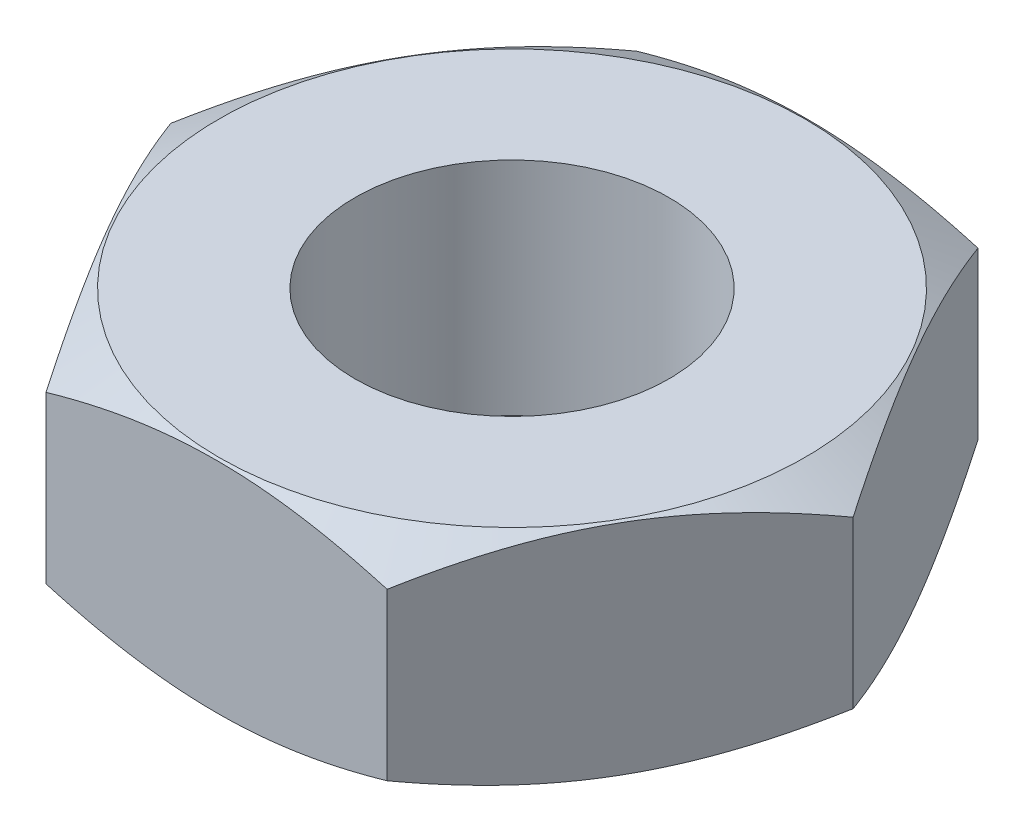
ISO-10303-21;
HEADER;
FILE_DESCRIPTION(('STEP AP214'),'2;1');
FILE_NAME('part.step','',(''),(''),'','','');
FILE_SCHEMA(('AUTOMOTIVE_DESIGN { 1 0 10303 214 1 1 1 1 }'));
ENDSEC;
DATA;
#1=APPLICATION_CONTEXT('core data for automotive mechanical design processes');
#2=APPLICATION_PROTOCOL_DEFINITION('international standard','automotive_design',2000,#1);
#3=PRODUCT_CONTEXT('',#1,'mechanical');
#4=PRODUCT('Part','Part','',(#3));
#5=PRODUCT_RELATED_PRODUCT_CATEGORY('part','',(#4));
#6=PRODUCT_DEFINITION_FORMATION('','',#4);
#7=PRODUCT_DEFINITION_CONTEXT('part definition',#1,'design');
#8=PRODUCT_DEFINITION('design','',#6,#7);
#9=PRODUCT_DEFINITION_SHAPE('','',#8);
#10=(LENGTH_UNIT() NAMED_UNIT(*) SI_UNIT(.MILLI.,.METRE.));
#11=(NAMED_UNIT(*) PLANE_ANGLE_UNIT() SI_UNIT($,.RADIAN.));
#12=(NAMED_UNIT(*) SI_UNIT($,.STERADIAN.) SOLID_ANGLE_UNIT());
#13=UNCERTAINTY_MEASURE_WITH_UNIT(LENGTH_MEASURE(1.E-05),#10,'distance_accuracy_value','');
#14=(GEOMETRIC_REPRESENTATION_CONTEXT(3) GLOBAL_UNCERTAINTY_ASSIGNED_CONTEXT((#13)) GLOBAL_UNIT_ASSIGNED_CONTEXT((#10,
#11,#12)) REPRESENTATION_CONTEXT('',''));
#15=CARTESIAN_POINT('',(0.,0.,0.));
#16=DIRECTION('',(0.,0.,1.));
#17=DIRECTION('',(1.,0.,0.));
#18=AXIS2_PLACEMENT_3D('',#15,#16,#17);
#19=CARTESIAN_POINT('',(-264.060006452342,-228.941222168841,-864.566900814825));
#20=DIRECTION('',(-0.866025403784429,0.,0.500000000000016));
#21=DIRECTION('',(0.500000000000016,0.,0.866025403784429));
#22=AXIS2_PLACEMENT_3D('',#19,#20,#21);
#23=PLANE('',#22);
#24=DIRECTION('',(0.499999999999978,0.,0.866025403784451));
#25=VECTOR('',#24,1.);
#26=CARTESIAN_POINT('',(-264.060006452342,-228.941222168841,-864.566900814825));
#27=LINE('',#26,#25);
#28=CARTESIAN_POINT('',(-264.060006452342,-228.941222168841,-864.566900814825));
#29=VERTEX_POINT('',#28);
#30=CARTESIAN_POINT('',(-262.472506452343,-228.941222168841,-861.817270157811));
#31=VERTEX_POINT('',#30);
#32=EDGE_CURVE('E125',#29,#31,#27,.T.);
#33=ORIENTED_EDGE('',*,*,#32,.T.);
#34=DIRECTION('',(0.,1.,0.));
#35=VECTOR('',#34,1.);
#36=CARTESIAN_POINT('',(-262.472506452343,-228.941222168841,-861.817270157811));
#37=LINE('',#36,#35);
#38=CARTESIAN_POINT('',(-262.472506452343,-227.353722168841,-861.817270157811));
#39=VERTEX_POINT('',#38);
#40=EDGE_CURVE('E128',#31,#39,#37,.T.);
#41=ORIENTED_EDGE('',*,*,#40,.T.);
#42=DIRECTION('',(-0.499999999999978,0.,-0.866025403784451));
#43=VECTOR('',#42,1.);
#44=CARTESIAN_POINT('',(-262.472506452343,-227.353722168841,-861.817270157811));
#45=LINE('',#44,#43);
#46=CARTESIAN_POINT('',(-264.060006452342,-227.353722168841,-864.566900814825));
#47=VERTEX_POINT('',#46);
#48=EDGE_CURVE('E113',#39,#47,#45,.T.);
#49=ORIENTED_EDGE('',*,*,#48,.T.);
#50=DIRECTION('',(0.,1.,0.));
#51=VECTOR('',#50,1.);
#52=CARTESIAN_POINT('',(-264.060006452342,-227.353722168841,-864.566900814825));
#53=LINE('',#52,#51);
#54=EDGE_CURVE('E119',#47,#29,#53,.F.);
#55=ORIENTED_EDGE('',*,*,#54,.T.);
#56=EDGE_LOOP('',(#33,#41,#49,#55));
#57=FACE_BOUND('',#56,.T.);
#58=ADVANCED_FACE('F17',(#57),#23,.T.);
#59=CARTESIAN_POINT('',(-262.472506452342,-228.941222168841,-864.566900814825));
#60=DIRECTION('',(0.,-1.,0.));
#61=DIRECTION('',(1.,0.,0.));
#62=AXIS2_PLACEMENT_3D('',#59,#60,#61);
#63=PLANE('',#62);
#64=DIRECTION('',(-0.866025403784429,0.,0.500000000000016));
#65=VECTOR('',#64,1.);
#66=CARTESIAN_POINT('',(-264.060006452342,-228.941222168841,-864.566900814825));
#67=LINE('',#66,#65);
#68=CARTESIAN_POINT('',(-264.403710284469,-228.941222168841,-864.368463314826));
#69=VERTEX_POINT('',#68);
#70=EDGE_CURVE('E122',#29,#69,#67,.T.);
#71=ORIENTED_EDGE('',*,*,#70,.T.);
#72=DIRECTION('',(0.500000000000016,0.,0.866025403784429));
#73=VECTOR('',#72,1.);
#74=CARTESIAN_POINT('',(-266.046650036362,-228.941222168841,-867.214118438881));
#75=LINE('',#74,#73);
#76=CARTESIAN_POINT('',(-262.816210284469,-228.941222168841,-861.618832657811));
#77=VERTEX_POINT('',#76);
#78=EDGE_CURVE('E85',#77,#69,#75,.F.);
#79=ORIENTED_EDGE('',*,*,#78,.F.);
#80=DIRECTION('',(0.866025403784429,0.,-0.500000000000016));
#81=VECTOR('',#80,1.);
#82=CARTESIAN_POINT('',(-262.472506452342,-228.941222168841,-861.817270157811));
#83=LINE('',#82,#81);
#84=EDGE_CURVE('E80',#77,#31,#83,.T.);
#85=ORIENTED_EDGE('',*,*,#84,.T.);
#86=ORIENTED_EDGE('',*,*,#32,.F.);
#87=EDGE_LOOP('',(#71,#79,#85,#86));
#88=FACE_BOUND('',#87,.T.);
#89=ADVANCED_FACE('F247',(#88),#63,.F.);
#90=CARTESIAN_POINT('',(-264.060006452342,-227.353722168841,-864.566900814825));
#91=DIRECTION('',(-0.500000000000016,0.,-0.866025403784429));
#92=DIRECTION('',(-0.866025403784429,0.,0.500000000000016));
#93=AXIS2_PLACEMENT_3D('',#90,#91,#92);
#94=PLANE('',#93);
#95=DIRECTION('',(-0.866025403785017,0.,0.499999999998999));
#96=VECTOR('',#95,1.);
#97=CARTESIAN_POINT('',(-264.060006452342,-227.353722168841,-864.566900814825));
#98=LINE('',#97,#96);
#99=CARTESIAN_POINT('',(-264.403710284468,-227.353722168841,-864.368463314826));
#100=VERTEX_POINT('',#99);
#101=EDGE_CURVE('E116',#47,#100,#98,.T.);
#102=ORIENTED_EDGE('',*,*,#101,.T.);
#103=DIRECTION('',(0.,1.,0.));
#104=VECTOR('',#103,1.);
#105=CARTESIAN_POINT('',(-264.403710284468,-231.36278379123,-864.368463314826));
#106=LINE('',#105,#104);
#107=EDGE_CURVE('E236',#69,#100,#106,.T.);
#108=ORIENTED_EDGE('',*,*,#107,.F.);
#109=ORIENTED_EDGE('',*,*,#70,.F.);
#110=ORIENTED_EDGE('',*,*,#54,.F.);
#111=EDGE_LOOP('',(#102,#108,#109,#110));
#112=FACE_BOUND('',#111,.T.);
#113=ADVANCED_FACE('F251',(#112),#94,.F.);
#114=CARTESIAN_POINT('',(-262.472506452342,-227.353722168841,-861.618832657811));
#115=DIRECTION('',(0.,1.,0.));
#116=DIRECTION('',(-1.,0.,0.));
#117=AXIS2_PLACEMENT_3D('',#114,#115,#116);
#118=PLANE('',#117);
#119=DIRECTION('',(0.866025403784429,0.,-0.500000000000016));
#120=VECTOR('',#119,1.);
#121=CARTESIAN_POINT('',(-262.472506452342,-227.353722168841,-861.817270157811));
#122=LINE('',#121,#120);
#123=CARTESIAN_POINT('',(-262.816210284469,-227.353722168841,-861.618832657811));
#124=VERTEX_POINT('',#123);
#125=EDGE_CURVE('E110',#39,#124,#122,.F.);
#126=ORIENTED_EDGE('',*,*,#125,.T.);
#127=DIRECTION('',(0.500000000000016,0.,0.866025403784429));
#128=VECTOR('',#127,1.);
#129=CARTESIAN_POINT('',(-266.046650036362,-227.353722168841,-867.214118438881));
#130=LINE('',#129,#128);
#131=EDGE_CURVE('E230',#100,#124,#130,.T.);
#132=ORIENTED_EDGE('',*,*,#131,.F.);
#133=ORIENTED_EDGE('',*,*,#101,.F.);
#134=ORIENTED_EDGE('',*,*,#48,.F.);
#135=EDGE_LOOP('',(#126,#132,#133,#134));
#136=FACE_BOUND('',#135,.T.);
#137=ADVANCED_FACE('F258',(#136),#118,.F.);
#138=CARTESIAN_POINT('',(-262.472506452342,-228.941222168841,-861.817270157811));
#139=DIRECTION('',(0.500000000000016,0.,0.866025403784429));
#140=DIRECTION('',(0.866025403784429,0.,-0.500000000000016));
#141=AXIS2_PLACEMENT_3D('',#138,#139,#140);
#142=PLANE('',#141);
#143=ORIENTED_EDGE('',*,*,#84,.F.);
#144=DIRECTION('',(0.,1.,0.));
#145=VECTOR('',#144,1.);
#146=CARTESIAN_POINT('',(-262.816210284468,-231.36278379123,-861.618832657811));
#147=LINE('',#146,#145);
#148=EDGE_CURVE('E226',#124,#77,#147,.F.);
#149=ORIENTED_EDGE('',*,*,#148,.F.);
#150=ORIENTED_EDGE('',*,*,#125,.F.);
#151=ORIENTED_EDGE('',*,*,#40,.F.);
#152=EDGE_LOOP('',(#143,#149,#150,#151));
#153=FACE_BOUND('',#152,.T.);
#154=ADVANCED_FACE('F175',(#153),#142,.F.);
#155=CARTESIAN_POINT('',(-256.680891028789,-225.906062100783,-866.994147986318));
#156=DIRECTION('',(0.,-1.,0.));
#157=DIRECTION('',(0.,0.,-1.));
#158=AXIS2_PLACEMENT_3D('',#155,#156,#157);
#159=CONICAL_SURFACE('',#158,9.24656656197476,1.0471975511964);
#160=CARTESIAN_POINT('',(-261.300270533087,-225.901554407295,-874.995147986318));
#161=CARTESIAN_POINT('',(-260.921114771988,-225.792070041498,-874.995147986318));
#162=CARTESIAN_POINT('',(-260.538884951673,-225.691842189086,-874.995147986318));
#163=CARTESIAN_POINT('',(-259.768216490001,-225.514702584041,-874.995147986318));
#164=CARTESIAN_POINT('',(-259.379765965437,-225.437842999742,-874.995147986318));
#165=CARTESIAN_POINT('',(-258.798155608761,-225.34476084359,-874.995147986318));
#166=CARTESIAN_POINT('',(-258.606740060718,-225.317631767625,-874.995147986318));
#167=CARTESIAN_POINT('',(-258.223019973663,-225.270710624705,-874.995147986318));
#168=CARTESIAN_POINT('',(-258.03071550696,-225.250917971249,-874.995147986318));
#169=CARTESIAN_POINT('',(-257.645657483167,-225.219095504846,-874.995147986318));
#170=CARTESIAN_POINT('',(-257.452904577422,-225.207057856925,-874.995147986318));
#171=CARTESIAN_POINT('',(-257.067064788806,-225.190977094069,-874.995147986318));
#172=CARTESIAN_POINT('',(-256.873977908797,-225.186933910933,-874.995147986318));
#173=CARTESIAN_POINT('',(-256.487804148813,-225.186933910933,-874.995147986318));
#174=CARTESIAN_POINT('',(-256.294717268837,-225.190977094067,-874.995147986318));
#175=CARTESIAN_POINT('',(-255.908877480286,-225.207057856918,-874.995147986318));
#176=CARTESIAN_POINT('',(-255.716124574574,-225.219095504835,-874.995147986318));
#177=CARTESIAN_POINT('',(-255.331066550845,-225.250917971227,-874.995147986318));
#178=CARTESIAN_POINT('',(-255.138762084175,-225.270710624677,-874.995147986318));
#179=CARTESIAN_POINT('',(-254.755041997184,-225.317631767582,-874.995147986318));
#180=CARTESIAN_POINT('',(-254.563626449173,-225.344760843538,-874.995147986318));
#181=CARTESIAN_POINT('',(-253.982016092595,-225.437842999659,-874.995147986318));
#182=CARTESIAN_POINT('',(-253.593565568097,-225.514702583934,-874.995147986318));
#183=CARTESIAN_POINT('',(-252.822897106552,-225.691842188925,-874.995147986318));
#184=CARTESIAN_POINT('',(-252.4406672863,-225.792070041307,-874.995147986318));
#185=CARTESIAN_POINT('',(-252.061511525262,-225.901554407073,-874.995147986318));
#186=B_SPLINE_CURVE_WITH_KNOTS('',3,(#160,#161,#162,#163,#164,#165,#166,#167,#168,#169,#170,
#171,#172,#173,#174,#175,#176,#177,#178,#179,#180,#181,#182,#183,#184,#185),.UNSPECIFIED.,.F.,
.F.,(4,2,2,2,2,2,2,2,2,2,2,2,4),(0.,1.18444162037853,2.37150834585124,2.95136525234158,
3.53117579282666,4.11039962123273,4.6896185082753,5.26883739521999,5.84806122352808,
6.42787176391491,7.00772867030692,8.19479539557346,9.37923701574761),.UNSPECIFIED.);
#187=CARTESIAN_POINT('',(-261.300270532641,-225.901554407108,-874.9951479862));
#188=VERTEX_POINT('',#187);
#189=CARTESIAN_POINT('',(-252.061511525132,-225.90155440711,-874.995147986318));
#190=VERTEX_POINT('',#189);
#191=EDGE_CURVE('E75',#188,#190,#186,.T.);
#192=ORIENTED_EDGE('',*,*,#191,.F.);
#193=CARTESIAN_POINT('',(-265.919650036361,-225.901554407147,-866.994147986317));
#194=CARTESIAN_POINT('',(-265.818111975216,-225.842942706194,-867.170017067122));
#195=CARTESIAN_POINT('',(-265.716195345363,-225.786991225116,-867.346541848163));
#196=CARTESIAN_POINT('',(-265.511534401004,-225.681141372124,-867.701025002118));
#197=CARTESIAN_POINT('',(-265.408789749485,-225.631245613004,-867.878983958754));
#198=CARTESIAN_POINT('',(-265.098910828198,-225.491621473732,-868.415709994618));
#199=CARTESIAN_POINT('',(-264.890553361649,-225.412206179042,-868.776595712818));
#200=CARTESIAN_POINT('',(-264.578750461173,-225.319084339318,-869.31665417839));
#201=CARTESIAN_POINT('',(-264.476236452372,-225.292557008116,-869.494213650121));
#202=CARTESIAN_POINT('',(-264.270744891277,-225.248076112502,-869.850135474463));
#203=CARTESIAN_POINT('',(-264.16776738075,-225.230121790582,-870.028497754732));
#204=CARTESIAN_POINT('',(-263.961635098376,-225.203241937167,-870.385529340884));
#205=CARTESIAN_POINT('',(-263.85848066133,-225.194306160339,-870.564198066875));
#206=CARTESIAN_POINT('',(-263.652076557858,-225.185654963021,-870.921700460978));
#207=CARTESIAN_POINT('',(-263.548826894475,-225.185939257581,-871.100534123823));
#208=CARTESIAN_POINT('',(-263.355805311341,-225.195086135617,-871.434857312768));
#209=CARTESIAN_POINT('',(-263.266019755766,-225.202832926475,-871.59037045681));
#210=CARTESIAN_POINT('',(-263.086658941807,-225.225148386836,-871.901032499474));
#211=CARTESIAN_POINT('',(-262.997083698004,-225.239717516066,-872.056181372841));
#212=CARTESIAN_POINT('',(-262.728704766994,-225.293314092146,-872.521027317031));
#213=CARTESIAN_POINT('',(-262.550376112616,-225.342224033509,-872.82990160686));
#214=CARTESIAN_POINT('',(-262.191827417759,-225.464497198711,-873.450926163339));
#215=CARTESIAN_POINT('',(-262.011653126706,-225.538378628208,-873.76299718966));
#216=CARTESIAN_POINT('',(-261.653991094516,-225.706057973448,-874.382486001352));
#217=CARTESIAN_POINT('',(-261.476498774794,-225.799816516966,-874.689911717063));
#218=CARTESIAN_POINT('',(-261.300270532697,-225.901554407076,-874.995147986105));
#219=B_SPLINE_CURVE_WITH_KNOTS('',3,(#193,#194,#195,#196,#197,#198,#199,#200,#201,#202,#203,
#204,#205,#206,#207,#208,#209,#210,#211,#212,#213,#214,#215,#216,#217,#218),.UNSPECIFIED.,.F.,
.F.,(4,2,2,2,2,2,2,2,2,2,2,2,4),(0.,0.634044888879152,1.2683623768608,2.53963248764432,
3.15969915011263,3.77971101350617,4.39901772956468,5.01830530569031,5.55738536939578,
6.09650176453845,7.17550226733199,8.27842983072162,9.37919281290504),.UNSPECIFIED.);
#220=CARTESIAN_POINT('',(-265.919650036361,-225.901554407147,-866.994147986317));
#221=VERTEX_POINT('',#220);
#222=EDGE_CURVE('E20',#221,#188,#219,.T.);
#223=ORIENTED_EDGE('',*,*,#222,.F.);
#224=CARTESIAN_POINT('',(-261.300270532449,-225.901554407228,-858.993147986203));
#225=CARTESIAN_POINT('',(-261.40180859362,-225.842942706253,-859.169017066989));
#226=CARTESIAN_POINT('',(-261.503725223486,-225.786991225164,-859.345541848025));
#227=CARTESIAN_POINT('',(-261.708386167856,-225.68114137216,-859.700025001978));
#228=CARTESIAN_POINT('',(-261.811130819373,-225.631245613041,-859.877983958619));
#229=CARTESIAN_POINT('',(-262.12100974066,-225.491621473765,-860.414709994494));
#230=CARTESIAN_POINT('',(-262.329367207215,-225.412206179068,-860.775595712697));
#231=CARTESIAN_POINT('',(-262.641170107696,-225.319084339337,-861.315654178276));
#232=CARTESIAN_POINT('',(-262.743684116498,-225.292557008132,-861.493213650009));
#233=CARTESIAN_POINT('',(-262.949175677595,-225.248076112515,-861.849135474356));
#234=CARTESIAN_POINT('',(-263.052153188124,-225.230121790592,-862.027497754627));
#235=CARTESIAN_POINT('',(-263.2582854705,-225.203241937173,-862.384529340784));
#236=CARTESIAN_POINT('',(-263.361439907548,-225.194306160343,-862.563198066777));
#237=CARTESIAN_POINT('',(-263.567844011023,-225.185654963022,-862.920700460885));
#238=CARTESIAN_POINT('',(-263.671093674408,-225.185939257581,-863.099534123733));
#239=CARTESIAN_POINT('',(-263.86411525755,-225.195086135614,-863.433857312692));
#240=CARTESIAN_POINT('',(-263.953900813132,-225.202832926471,-863.589370456747));
#241=CARTESIAN_POINT('',(-264.133261627106,-225.225148386833,-863.900032499436));
#242=CARTESIAN_POINT('',(-264.222836870916,-225.239717516064,-864.055181372815));
#243=CARTESIAN_POINT('',(-264.491215801947,-225.293314092147,-864.520027317043));
#244=CARTESIAN_POINT('',(-264.66954445634,-225.342224033515,-864.828901606896));
#245=CARTESIAN_POINT('',(-265.028093151226,-225.46449719873,-865.449926163426));
#246=CARTESIAN_POINT('',(-265.208267442293,-225.538378628235,-865.761997189772));
#247=CARTESIAN_POINT('',(-265.565929474513,-225.706057973495,-866.381486001515));
#248=CARTESIAN_POINT('',(-265.743421794249,-225.799816517024,-866.688911717251));
#249=CARTESIAN_POINT('',(-265.919650036361,-225.901554407147,-866.994147986317));
#250=B_SPLINE_CURVE_WITH_KNOTS('',3,(#224,#225,#226,#227,#228,#229,#230,#231,#232,#233,#234,
#235,#236,#237,#238,#239,#240,#241,#242,#243,#244,#245,#246,#247,#248,#249),.UNSPECIFIED.,.F.,
.F.,(4,2,2,2,2,2,2,2,2,2,2,2,4),(0.,0.634044888890061,1.26836237688205,2.53963248768583,
3.15969915016272,3.77971101356455,4.39901772963153,5.01830530576582,5.55738536951428,
6.0965017647002,7.17550226758012,8.27842983106154,9.37919281333671),.UNSPECIFIED.);
#251=CARTESIAN_POINT('',(-261.300270532444,-225.90155440711,-858.993147986318));
#252=VERTEX_POINT('',#251);
#253=EDGE_CURVE('E73',#252,#221,#250,.T.);
#254=ORIENTED_EDGE('',*,*,#253,.F.);
#255=CARTESIAN_POINT('',(-252.061511524843,-225.901554407227,-858.993147986369));
#256=CARTESIAN_POINT('',(-252.44066728591,-225.792070041423,-858.993147986336));
#257=CARTESIAN_POINT('',(-252.822897106195,-225.691842189017,-858.993147986323));
#258=CARTESIAN_POINT('',(-253.593565567809,-225.51470258399,-858.993147986313));
#259=CARTESIAN_POINT('',(-253.982016092345,-225.437842999704,-858.993147986317));
#260=CARTESIAN_POINT('',(-254.563626448977,-225.344760843567,-858.993147986318));
#261=CARTESIAN_POINT('',(-254.755041997005,-225.317631767606,-858.993147986318));
#262=CARTESIAN_POINT('',(-255.138762084031,-225.270710624693,-858.993147986318));
#263=CARTESIAN_POINT('',(-255.331066550719,-225.250917971239,-858.993147986318));
#264=CARTESIAN_POINT('',(-255.716124574484,-225.219095504841,-858.993147986318));
#265=CARTESIAN_POINT('',(-255.908877480214,-225.207057856922,-858.993147986318));
#266=CARTESIAN_POINT('',(-256.294717268801,-225.190977094068,-858.993147986318));
#267=CARTESIAN_POINT('',(-256.487804148795,-225.186933910933,-858.993147986318));
#268=CARTESIAN_POINT('',(-256.873977908765,-225.186933910933,-858.993147986318));
#269=CARTESIAN_POINT('',(-257.06706478874,-225.190977094067,-858.993147986318));
#270=CARTESIAN_POINT('',(-257.452904577291,-225.207057856918,-858.993147986318));
#271=CARTESIAN_POINT('',(-257.645657483004,-225.219095504835,-858.993147986318));
#272=CARTESIAN_POINT('',(-258.030715506732,-225.250917971227,-858.993147986318));
#273=CARTESIAN_POINT('',(-258.223019973402,-225.270710624677,-858.993147986318));
#274=CARTESIAN_POINT('',(-258.606740060392,-225.317631767581,-858.993147986318));
#275=CARTESIAN_POINT('',(-258.798155608403,-225.344760843537,-858.993147986318));
#276=CARTESIAN_POINT('',(-259.379765964981,-225.437842999659,-858.993147986318));
#277=CARTESIAN_POINT('',(-259.768216489479,-225.514702583934,-858.993147986318));
#278=CARTESIAN_POINT('',(-260.538884951024,-225.691842188924,-858.993147986318));
#279=CARTESIAN_POINT('',(-260.921114771276,-225.792070041306,-858.993147986318));
#280=CARTESIAN_POINT('',(-261.300270532314,-225.901554407072,-858.993147986318));
#281=B_SPLINE_CURVE_WITH_KNOTS('',3,(#255,#256,#257,#258,#259,#260,#261,#262,#263,#264,#265,
#266,#267,#268,#269,#270,#271,#272,#273,#274,#275,#276,#277,#278,#279,#280),.UNSPECIFIED.,.F.,
.F.,(4,2,2,2,2,2,2,2,2,2,2,2,4),(0.,1.18444162028826,2.37150834566903,2.95136525211517,
3.53117579255617,4.11039962091842,4.68961850791721,5.26883739486157,5.84806122316938,
6.42787176355571,7.0077286699472,8.19479539521327,9.37923701538739),.UNSPECIFIED.);
#282=CARTESIAN_POINT('',(-252.061511524939,-225.90155440711,-858.99314798643));
#283=VERTEX_POINT('',#282);
#284=EDGE_CURVE('E90',#283,#252,#281,.T.);
#285=ORIENTED_EDGE('',*,*,#284,.F.);
#286=CARTESIAN_POINT('',(-247.442132021215,-225.901554407148,-866.994147986321));
#287=CARTESIAN_POINT('',(-247.54367008236,-225.842942706195,-866.818278905516));
#288=CARTESIAN_POINT('',(-247.645586712213,-225.786991225117,-866.641754124474));
#289=CARTESIAN_POINT('',(-247.850247656572,-225.681141372125,-866.287270970519));
#290=CARTESIAN_POINT('',(-247.952992308091,-225.631245613005,-866.109312013883));
#291=CARTESIAN_POINT('',(-248.262871229378,-225.491621473733,-865.57258597802));
#292=CARTESIAN_POINT('',(-248.471228695928,-225.412206179043,-865.211700259819));
#293=CARTESIAN_POINT('',(-248.783031596404,-225.319084339319,-864.671641794247));
#294=CARTESIAN_POINT('',(-248.885545605205,-225.292557008117,-864.494082322517));
#295=CARTESIAN_POINT('',(-249.091037166299,-225.248076112503,-864.138160498174));
#296=CARTESIAN_POINT('',(-249.194014676826,-225.230121790582,-863.959798217905));
#297=CARTESIAN_POINT('',(-249.4001469592,-225.203241937168,-863.602766631753));
#298=CARTESIAN_POINT('',(-249.503301396246,-225.194306160339,-863.424097905762));
#299=CARTESIAN_POINT('',(-249.709705499718,-225.185654963022,-863.066595511659));
#300=CARTESIAN_POINT('',(-249.812955163102,-225.185939257581,-862.887761848814));
#301=CARTESIAN_POINT('',(-250.005976746235,-225.195086135617,-862.553438659869));
#302=CARTESIAN_POINT('',(-250.09576230181,-225.202832926475,-862.397925515828));
#303=CARTESIAN_POINT('',(-250.275123115769,-225.225148386836,-862.087263473165));
#304=CARTESIAN_POINT('',(-250.364698359571,-225.239717516067,-861.932114599798));
#305=CARTESIAN_POINT('',(-250.633077290581,-225.293314092146,-861.467268655609));
#306=CARTESIAN_POINT('',(-250.811405944958,-225.342224033509,-861.158394365781));
#307=CARTESIAN_POINT('',(-251.169954639814,-225.46449719871,-860.537369809304));
#308=CARTESIAN_POINT('',(-251.350128930866,-225.538378628206,-860.225298782984));
#309=CARTESIAN_POINT('',(-251.707790963056,-225.706057973445,-859.605809971293));
#310=CARTESIAN_POINT('',(-251.885283282777,-225.799816516963,-859.298384255583));
#311=CARTESIAN_POINT('',(-252.061511524874,-225.901554407073,-858.993147986541));
#312=B_SPLINE_CURVE_WITH_KNOTS('',3,(#286,#287,#288,#289,#290,#291,#292,#293,#294,#295,#296,
#297,#298,#299,#300,#301,#302,#303,#304,#305,#306,#307,#308,#309,#310,#311),.UNSPECIFIED.,.F.,
.F.,(4,2,2,2,2,2,2,2,2,2,2,2,4),(0.,0.63404488887938,1.26836237686097,2.53963248764476,
3.15969915011321,3.77971101350686,4.39901772956551,5.01830530569125,5.55738536939518,
6.09650176453644,7.17550226732707,8.27842983071343,9.37919281289419),.UNSPECIFIED.);
#313=CARTESIAN_POINT('',(-247.442132021216,-225.901554407148,-866.994147986319));
#314=VERTEX_POINT('',#313);
#315=EDGE_CURVE('E99',#314,#283,#312,.T.);
#316=ORIENTED_EDGE('',*,*,#315,.F.);
#317=CARTESIAN_POINT('',(-252.061511525127,-225.901554407229,-874.995147986434));
#318=CARTESIAN_POINT('',(-251.959973463955,-225.842942706254,-874.819278905647));
#319=CARTESIAN_POINT('',(-251.858056834089,-225.786991225165,-874.642754124611));
#320=CARTESIAN_POINT('',(-251.65339588972,-225.681141372161,-874.288270970658));
#321=CARTESIAN_POINT('',(-251.550651238202,-225.631245613042,-874.110312014018));
#322=CARTESIAN_POINT('',(-251.240772316915,-225.491621473766,-873.573585978143));
#323=CARTESIAN_POINT('',(-251.03241485036,-225.412206179069,-873.212700259939));
#324=CARTESIAN_POINT('',(-250.720611949879,-225.319084339338,-872.67264179436));
#325=CARTESIAN_POINT('',(-250.618097941077,-225.292557008134,-872.495082322627));
#326=CARTESIAN_POINT('',(-250.41260637998,-225.248076112516,-872.13916049828));
#327=CARTESIAN_POINT('',(-250.309628869452,-225.230121790593,-871.960798218008));
#328=CARTESIAN_POINT('',(-250.103496587075,-225.203241937175,-871.603766631852));
#329=CARTESIAN_POINT('',(-250.000342150027,-225.194306160345,-871.425097905859));
#330=CARTESIAN_POINT('',(-249.793938046552,-225.185654963023,-871.06759551175));
#331=CARTESIAN_POINT('',(-249.690688383167,-225.185939257582,-870.888761848903));
#332=CARTESIAN_POINT('',(-249.497666800025,-225.195086135615,-870.554438659943));
#333=CARTESIAN_POINT('',(-249.407881244443,-225.202832926473,-870.398925515889));
#334=CARTESIAN_POINT('',(-249.22852043047,-225.225148386834,-870.0882634732));
#335=CARTESIAN_POINT('',(-249.138945186659,-225.239717516066,-869.933114599821));
#336=CARTESIAN_POINT('',(-248.870566255628,-225.293314092149,-869.468268655593));
#337=CARTESIAN_POINT('',(-248.692237601236,-225.342224033517,-869.15939436574));
#338=CARTESIAN_POINT('',(-248.33368890635,-225.464497198731,-868.538369809211));
#339=CARTESIAN_POINT('',(-248.153514615283,-225.538378628237,-868.226298782865));
#340=CARTESIAN_POINT('',(-247.795852583063,-225.706057973496,-867.606809971123));
#341=CARTESIAN_POINT('',(-247.618360263328,-225.799816517026,-867.299384255387));
#342=CARTESIAN_POINT('',(-247.442132021216,-225.901554407148,-866.994147986321));
#343=B_SPLINE_CURVE_WITH_KNOTS('',3,(#317,#318,#319,#320,#321,#322,#323,#324,#325,#326,#327,
#328,#329,#330,#331,#332,#333,#334,#335,#336,#337,#338,#339,#340,#341,#342),.UNSPECIFIED.,.F.,
.F.,(4,2,2,2,2,2,2,2,2,2,2,2,4),(0.,0.634044888890105,1.26836237688224,2.5396324876861,
3.15969915016299,3.77971101356506,4.39901772963216,5.01830530576659,5.55738536951453,
6.09650176470031,7.1755022675795,8.27842983106014,9.37919281333471),.UNSPECIFIED.);
#344=EDGE_CURVE('E103',#190,#314,#343,.T.);
#345=ORIENTED_EDGE('',*,*,#344,.F.);
#346=EDGE_LOOP('',(#192,#223,#254,#285,#316,#345));
#347=FACE_BOUND('',#346,.T.);
#348=CARTESIAN_POINT('',(-256.680891028789,-225.15027216884,-866.994147986318));
#349=DIRECTION('',(0.,-1.,0.));
#350=DIRECTION('',(0.,0.,-1.));
#351=AXIS2_PLACEMENT_3D('',#348,#349,#350);
#352=CIRCLE('',#351,7.93750000000004);
#353=CARTESIAN_POINT('',(-256.680891028789,-225.15027216884,-874.931647986318));
#354=VERTEX_POINT('',#353);
#355=EDGE_CURVE('E166',#354,#354,#352,.F.);
#356=ORIENTED_EDGE('',*,*,#355,.F.);
#357=EDGE_LOOP('',(#356));
#358=FACE_BOUND('',#357,.T.);
#359=ADVANCED_FACE('F71',(#347,#358),#159,.T.);
#360=CARTESIAN_POINT('',(-261.173270524246,-224.916129573936,-875.215118453303));
#361=DIRECTION('',(-0.866025403784429,0.,-0.500000000000017));
#362=DIRECTION('',(-0.500000000000017,0.,0.866025403784429));
#363=AXIS2_PLACEMENT_3D('',#360,#361,#362);
#364=PLANE('',#363);
#365=DIRECTION('',(0.,1.,0.));
#366=VECTOR('',#365,1.);
#367=CARTESIAN_POINT('',(-265.91965003636,-231.36278379123,-866.994147986317));
#368=LINE('',#367,#366);
#369=CARTESIAN_POINT('',(-265.91965003636,-230.393389930533,-866.994147986317));
#370=VERTEX_POINT('',#369);
#371=EDGE_CURVE('E40',#221,#370,#368,.F.);
#372=ORIENTED_EDGE('',*,*,#371,.F.);
#373=ORIENTED_EDGE('',*,*,#222,.T.);
#374=DIRECTION('',(0.,1.,0.));
#375=VECTOR('',#374,1.);
#376=CARTESIAN_POINT('',(-261.300270532573,-231.362783791227,-874.995147986318));
#377=LINE('',#376,#375);
#378=CARTESIAN_POINT('',(-261.300270554224,-230.393389943033,-874.995147948818));
#379=VERTEX_POINT('',#378);
#380=EDGE_CURVE('E79',#379,#188,#377,.T.);
#381=ORIENTED_EDGE('',*,*,#380,.F.);
#382=CARTESIAN_POINT('',(-265.91965003636,-230.393389930533,-866.994147986318));
#383=CARTESIAN_POINT('',(-265.818111975222,-230.452001631482,-867.17001706711));
#384=CARTESIAN_POINT('',(-265.716195345376,-230.507953112556,-867.34654184814));
#385=CARTESIAN_POINT('',(-265.511534401032,-230.613802965542,-867.70102500207));
#386=CARTESIAN_POINT('',(-265.40878974952,-230.663698724659,-867.878983958693));
#387=CARTESIAN_POINT('',(-265.098910828257,-230.803322863923,-868.415709994517));
#388=CARTESIAN_POINT('',(-264.890553361723,-230.88273815861,-868.776595712689));
#389=CARTESIAN_POINT('',(-264.578750461257,-230.975859998339,-869.316654178244));
#390=CARTESIAN_POINT('',(-264.476236452449,-231.002387329545,-869.494213649987));
#391=CARTESIAN_POINT('',(-264.27074489134,-231.046868225166,-869.850135474354));
#392=CARTESIAN_POINT('',(-264.167767380806,-231.06482254709,-870.028497754637));
#393=CARTESIAN_POINT('',(-263.961635098416,-231.091702400509,-870.385529340815));
#394=CARTESIAN_POINT('',(-263.858480661362,-231.100638177339,-870.56419806682));
#395=CARTESIAN_POINT('',(-263.652076557874,-231.109289374659,-870.921700460952));
#396=CARTESIAN_POINT('',(-263.548826894482,-231.109005080099,-871.10053412381));
#397=CARTESIAN_POINT('',(-263.355805313164,-231.099858202149,-871.43485730961));
#398=CARTESIAN_POINT('',(-263.266019759411,-231.09211141152,-871.590370450497));
#399=CARTESIAN_POINT('',(-263.086658949084,-231.069795951888,-871.901032486869));
#400=CARTESIAN_POINT('',(-262.997083707092,-231.055226823159,-872.0561813571));
#401=CARTESIAN_POINT('',(-262.7287047815,-231.001630248968,-872.521027291906));
#402=CARTESIAN_POINT('',(-262.550376130703,-230.952720309377,-872.829901575532));
#403=CARTESIAN_POINT('',(-262.19182744309,-230.830447148593,-873.450926119465));
#404=CARTESIAN_POINT('',(-262.011653155696,-230.756565721776,-873.762997139448));
#405=CARTESIAN_POINT('',(-261.653991130691,-230.588886382477,-874.382485938695));
#406=CARTESIAN_POINT('',(-261.476498814495,-230.495127842216,-874.689911648299));
#407=CARTESIAN_POINT('',(-261.300270575875,-230.393389955533,-874.995147911317));
#408=B_SPLINE_CURVE_WITH_KNOTS('',3,(#382,#383,#384,#385,#386,#387,#388,#389,#390,#391,#392,
#393,#394,#395,#396,#397,#398,#399,#400,#401,#402,#403,#404,#405,#406,#407),.UNSPECIFIED.,.F.,
.F.,(4,2,2,2,2,2,2,2,2,2,2,2,4),(0.,0.634044888835421,1.26836237677327,2.53963248745809,
3.15969914997096,3.77971101340879,4.39901772951673,5.01830530569003,5.55738535845396,
6.09650174265197,7.17550222348983,8.27842976378376,9.37919272304723),.UNSPECIFIED.);
#409=EDGE_CURVE('E89',#370,#379,#408,.T.);
#410=ORIENTED_EDGE('',*,*,#409,.F.);
#411=EDGE_LOOP('',(#372,#373,#381,#410));
#412=FACE_BOUND('',#411,.T.);
#413=ADVANCED_FACE('F88',(#412),#364,.T.);
#414=CARTESIAN_POINT('',(-261.554270532574,-231.362783791227,-874.995147986318));
#415=DIRECTION('',(0.,0.,-1.));
#416=DIRECTION('',(-1.,0.,0.));
#417=AXIS2_PLACEMENT_3D('',#414,#415,#416);
#418=PLANE('',#417);
#419=ORIENTED_EDGE('',*,*,#380,.T.);
#420=ORIENTED_EDGE('',*,*,#191,.T.);
#421=DIRECTION('',(0.,1.,0.));
#422=VECTOR('',#421,1.);
#423=CARTESIAN_POINT('',(-252.061511525001,-224.916129574365,-874.995147986319));
#424=LINE('',#423,#422);
#425=CARTESIAN_POINT('',(-252.061511568303,-230.393389943032,-874.995147986318));
#426=VERTEX_POINT('',#425);
#427=EDGE_CURVE('E104',#426,#190,#424,.T.);
#428=ORIENTED_EDGE('',*,*,#427,.F.);
#429=CARTESIAN_POINT('',(-261.300270565883,-230.393389920917,-874.995147986318));
#430=CARTESIAN_POINT('',(-261.097194443332,-230.452001622262,-874.995147986318));
#431=CARTESIAN_POINT('',(-260.893361183363,-230.507953103743,-874.995147986318));
#432=CARTESIAN_POINT('',(-260.484039294116,-230.613802957559,-874.995147986318));
#433=CARTESIAN_POINT('',(-260.278549990811,-230.663698717099,-874.995147986318));
#434=CARTESIAN_POINT('',(-259.658792147406,-230.803322857666,-874.995147986318));
#435=CARTESIAN_POINT('',(-259.242077213731,-230.882738153254,-874.995147986318));
#436=CARTESIAN_POINT('',(-258.618471411869,-230.975859994329,-874.995147986318));
#437=CARTESIAN_POINT('',(-258.413443393957,-231.002387325977,-874.995147986318));
#438=CARTESIAN_POINT('',(-258.002460271131,-231.046868222476,-874.995147986318));
#439=CARTESIAN_POINT('',(-257.79650524975,-231.064822544837,-874.995147986318));
#440=CARTESIAN_POINT('',(-257.38424068433,-231.091702399114,-874.995147986318));
#441=CARTESIAN_POINT('',(-257.177931809893,-231.100638176365,-874.995147986318));
#442=CARTESIAN_POINT('',(-256.765123602242,-231.109289374501,-874.995147986318));
#443=CARTESIAN_POINT('',(-256.558624275111,-231.109005080336,-874.995147986318));
#444=CARTESIAN_POINT('',(-256.172581111061,-231.099858203074,-874.995147986318));
#445=CARTESIAN_POINT('',(-255.99301000249,-231.092111412711,-874.995147986318));
#446=CARTESIAN_POINT('',(-255.634288379703,-231.069795953526,-874.995147986318));
#447=CARTESIAN_POINT('',(-255.455137894648,-231.055226824975,-874.995147986318));
#448=CARTESIAN_POINT('',(-254.918380040246,-231.001630251186,-874.995147986318));
#449=CARTESIAN_POINT('',(-254.561722736504,-230.952720311683,-874.995147986318));
#450=CARTESIAN_POINT('',(-253.844625356906,-230.830447150746,-874.995147986318));
#451=CARTESIAN_POINT('',(-253.484276779897,-230.756565723675,-874.995147986318));
#452=CARTESIAN_POINT('',(-252.76895272551,-230.588886383605,-874.995147986318));
#453=CARTESIAN_POINT('',(-252.413968090966,-230.495127842828,-874.995147986318));
#454=CARTESIAN_POINT('',(-252.061511611605,-230.393389955532,-874.995147986318));
#455=B_SPLINE_CURVE_WITH_KNOTS('',3,(#429,#430,#431,#432,#433,#434,#435,#436,#437,#438,#439,
#440,#441,#442,#443,#444,#445,#446,#447,#448,#449,#450,#451,#452,#453,#454),.UNSPECIFIED.,.F.,
.F.,(4,2,2,2,2,2,2,2,2,2,2,2,4),(0.,0.634044889958151,1.26836237901932,2.53963249200919,
3.15969915557073,3.77971102005685,4.39901773720305,5.01830531441454,5.55738537033158,
6.09650175768361,7.1755022448491,8.27842979181336,9.37919275770498),.UNSPECIFIED.);
#456=EDGE_CURVE('E213',#379,#426,#455,.T.);
#457=ORIENTED_EDGE('',*,*,#456,.F.);
#458=EDGE_LOOP('',(#419,#420,#428,#457));
#459=FACE_BOUND('',#458,.T.);
#460=ADVANCED_FACE('F278',(#459),#418,.T.);
#461=CARTESIAN_POINT('',(-247.315132021215,-224.916129574365,-866.774177533758));
#462=DIRECTION('',(0.866025403784429,0.,-0.500000000000016));
#463=DIRECTION('',(-0.500000000000016,0.,-0.866025403784429));
#464=AXIS2_PLACEMENT_3D('',#461,#462,#463);
#465=PLANE('',#464);
#466=ORIENTED_EDGE('',*,*,#427,.T.);
#467=ORIENTED_EDGE('',*,*,#344,.T.);
#468=DIRECTION('',(0.,1.,0.));
#469=VECTOR('',#468,1.);
#470=CARTESIAN_POINT('',(-247.442132021217,-231.362783791238,-866.994147986318));
#471=LINE('',#470,#469);
#472=CARTESIAN_POINT('',(-247.442132021216,-230.393389930532,-866.994147986319));
#473=VERTEX_POINT('',#472);
#474=EDGE_CURVE('E100',#473,#314,#471,.T.);
#475=ORIENTED_EDGE('',*,*,#474,.F.);
#476=CARTESIAN_POINT('',(-252.061511541656,-230.393389920916,-874.995148015166));
#477=CARTESIAN_POINT('',(-251.959973480373,-230.452001622265,-874.819278934123));
#478=CARTESIAN_POINT('',(-251.858056850382,-230.507953103749,-874.642754152841));
#479=CARTESIAN_POINT('',(-251.653395905744,-230.613802957572,-874.288270998403));
#480=CARTESIAN_POINT('',(-251.550651254084,-230.663698717115,-874.110312041523));
#481=CARTESIAN_POINT('',(-251.240772332358,-230.803322857689,-873.573586004898));
#482=CARTESIAN_POINT('',(-251.032414865504,-230.882738153281,-873.21270028617));
#483=CARTESIAN_POINT('',(-250.720611964563,-230.975859994351,-872.672641819794));
#484=CARTESIAN_POINT('',(-250.618097955615,-231.002387325995,-872.495082347808));
#485=CARTESIAN_POINT('',(-250.412606394216,-231.046868222487,-872.139160522939));
#486=CARTESIAN_POINT('',(-250.309628883533,-231.064822544844,-871.960798242399));
#487=CARTESIAN_POINT('',(-250.103496600839,-231.091702399117,-871.603766655691));
#488=CARTESIAN_POINT('',(-250.000342163628,-231.100638176366,-871.425097929417));
#489=CARTESIAN_POINT('',(-249.793938059819,-231.1092893745,-871.067595534728));
#490=CARTESIAN_POINT('',(-249.690688396262,-231.109005080335,-870.888761871583));
#491=CARTESIAN_POINT('',(-249.497666812416,-231.099858202986,-870.554438681404));
#492=CARTESIAN_POINT('',(-249.407881256303,-231.092111412395,-870.398925536432));
#493=CARTESIAN_POINT('',(-249.228520441267,-231.069795952477,-870.088263491902));
#494=CARTESIAN_POINT('',(-249.138945196924,-231.055226823424,-869.933114617599));
#495=CARTESIAN_POINT('',(-248.87056626429,-231.001630247741,-869.468268670596));
#496=CARTESIAN_POINT('',(-248.692237608827,-230.952720306461,-869.159394378889));
#497=CARTESIAN_POINT('',(-248.333688911764,-230.830447141093,-868.538369818588));
#498=CARTESIAN_POINT('',(-248.15351461959,-230.756565711336,-868.226298790325));
#499=CARTESIAN_POINT('',(-247.795852585191,-230.588886365308,-867.606809974808));
#500=CARTESIAN_POINT('',(-247.618360264383,-230.495127821264,-867.299384257214));
#501=CARTESIAN_POINT('',(-247.442132021215,-230.393389930531,-866.994147986319));
#502=B_SPLINE_CURVE_WITH_KNOTS('',3,(#476,#477,#478,#479,#480,#481,#482,#483,#484,#485,#486,
#487,#488,#489,#490,#491,#492,#493,#494,#495,#496,#497,#498,#499,#500,#501),.UNSPECIFIED.,.F.,
.F.,(4,2,2,2,2,2,2,2,2,2,2,2,4),(0.,0.634044890002092,1.26836237910722,2.53963249219628,
3.15969915571334,3.77971102015515,4.39901773725191,5.01830531441585,5.55738538130537,
6.0965017796329,7.1755022888159,8.27842985894104,9.37919284781729),.UNSPECIFIED.);
#503=EDGE_CURVE('E207',#426,#473,#502,.T.);
#504=ORIENTED_EDGE('',*,*,#503,.F.);
#505=EDGE_LOOP('',(#466,#467,#475,#504));
#506=FACE_BOUND('',#505,.T.);
#507=ADVANCED_FACE('F197',(#506),#465,.T.);
#508=CARTESIAN_POINT('',(-247.315132021216,-231.362783791238,-867.214118438881));
#509=DIRECTION('',(0.866025403784429,0.,0.500000000000017));
#510=DIRECTION('',(0.500000000000017,0.,-0.866025403784429));
#511=AXIS2_PLACEMENT_3D('',#508,#509,#510);
#512=PLANE('',#511);
#513=ORIENTED_EDGE('',*,*,#474,.T.);
#514=ORIENTED_EDGE('',*,*,#315,.T.);
#515=DIRECTION('',(0.,1.,0.));
#516=VECTOR('',#515,1.);
#517=CARTESIAN_POINT('',(-252.061511525003,-231.36278379123,-858.993147986318));
#518=LINE('',#517,#516);
#519=CARTESIAN_POINT('',(-252.061511503352,-230.393389943033,-858.993148023819));
#520=VERTEX_POINT('',#519);
#521=EDGE_CURVE('E93',#520,#283,#518,.T.);
#522=ORIENTED_EDGE('',*,*,#521,.F.);
#523=CARTESIAN_POINT('',(-247.442132021217,-230.393389930532,-866.994147986318));
#524=CARTESIAN_POINT('',(-247.543670082354,-230.452001631481,-866.818278905526));
#525=CARTESIAN_POINT('',(-247.645586712201,-230.507953112555,-866.641754124496));
#526=CARTESIAN_POINT('',(-247.850247656545,-230.613802965542,-866.287270970566));
#527=CARTESIAN_POINT('',(-247.952992308057,-230.663698724658,-866.109312013943));
#528=CARTESIAN_POINT('',(-248.26287122932,-230.803322863922,-865.572585978119));
#529=CARTESIAN_POINT('',(-248.471228695854,-230.882738158609,-865.211700259948));
#530=CARTESIAN_POINT('',(-248.78303159632,-230.975859998338,-864.671641794392));
#531=CARTESIAN_POINT('',(-248.885545605128,-231.002387329544,-864.494082322649));
#532=CARTESIAN_POINT('',(-249.091037166237,-231.046868225165,-864.138160498282));
#533=CARTESIAN_POINT('',(-249.194014676771,-231.064822547089,-863.959798217999));
#534=CARTESIAN_POINT('',(-249.400146959161,-231.091702400509,-863.60276663182));
#535=CARTESIAN_POINT('',(-249.503301396215,-231.100638177339,-863.424097905816));
#536=CARTESIAN_POINT('',(-249.709705499703,-231.109289374658,-863.066595511684));
#537=CARTESIAN_POINT('',(-249.812955163095,-231.109005080099,-862.887761848825));
#538=CARTESIAN_POINT('',(-250.005976744413,-231.099858202149,-862.553438663025));
#539=CARTESIAN_POINT('',(-250.095762298166,-231.092111411519,-862.397925522139));
#540=CARTESIAN_POINT('',(-250.275123108493,-231.069795951888,-862.087263485767));
#541=CARTESIAN_POINT('',(-250.364698350485,-231.055226823159,-861.932114615536));
#542=CARTESIAN_POINT('',(-250.633077276077,-231.001630248968,-861.46726868073));
#543=CARTESIAN_POINT('',(-250.811405926874,-230.952720309376,-861.158394397104));
#544=CARTESIAN_POINT('',(-251.169954614487,-230.830447148593,-860.537369853172));
#545=CARTESIAN_POINT('',(-251.35012890188,-230.756565721775,-860.225298833189));
#546=CARTESIAN_POINT('',(-251.707790926886,-230.588886382476,-859.605810033941));
#547=CARTESIAN_POINT('',(-251.885283243081,-230.495127842216,-859.298384324338));
#548=CARTESIAN_POINT('',(-252.061511481701,-230.393389955533,-858.993148061319));
#549=B_SPLINE_CURVE_WITH_KNOTS('',3,(#523,#524,#525,#526,#527,#528,#529,#530,#531,#532,#533,
#534,#535,#536,#537,#538,#539,#540,#541,#542,#543,#544,#545,#546,#547,#548),.UNSPECIFIED.,.F.,
.F.,(4,2,2,2,2,2,2,2,2,2,2,2,4),(0.,0.634044888835521,1.26836237677352,2.53963248745836,
3.15969914997121,3.77971101340929,4.39901772951726,5.01830530569053,5.55738535845434,
6.09650174265222,7.17550222348995,8.27842976378332,9.37919272304693),.UNSPECIFIED.);
#550=EDGE_CURVE('E201',#473,#520,#549,.T.);
#551=ORIENTED_EDGE('',*,*,#550,.F.);
#552=EDGE_LOOP('',(#513,#514,#522,#551));
#553=FACE_BOUND('',#552,.T.);
#554=ADVANCED_FACE('F194',(#553),#512,.T.);
#555=CARTESIAN_POINT('',(-261.554270549229,-231.36278379123,-858.993147986318));
#556=DIRECTION('',(0.,0.,1.));
#557=DIRECTION('',(1.,0.,0.));
#558=AXIS2_PLACEMENT_3D('',#555,#556,#557);
#559=PLANE('',#558);
#560=ORIENTED_EDGE('',*,*,#521,.T.);
#561=ORIENTED_EDGE('',*,*,#284,.T.);
#562=DIRECTION('',(0.,1.,0.));
#563=VECTOR('',#562,1.);
#564=CARTESIAN_POINT('',(-261.300270532575,-231.36278379123,-858.993147986318));
#565=LINE('',#564,#563);
#566=CARTESIAN_POINT('',(-261.300270489273,-230.393389943033,-858.993147986318));
#567=VERTEX_POINT('',#566);
#568=EDGE_CURVE('E84',#567,#252,#565,.T.);
#569=ORIENTED_EDGE('',*,*,#568,.F.);
#570=CARTESIAN_POINT('',(-252.061511491694,-230.393389920917,-858.993147986318));
#571=CARTESIAN_POINT('',(-252.264587614244,-230.452001622262,-858.993147986318));
#572=CARTESIAN_POINT('',(-252.468420874213,-230.507953103742,-858.993147986318));
#573=CARTESIAN_POINT('',(-252.877742763461,-230.613802957558,-858.993147986318));
#574=CARTESIAN_POINT('',(-253.083232066766,-230.663698717099,-858.993147986318));
#575=CARTESIAN_POINT('',(-253.702989910171,-230.803322857666,-858.993147986318));
#576=CARTESIAN_POINT('',(-254.119704843846,-230.882738153254,-858.993147986318));
#577=CARTESIAN_POINT('',(-254.743310645708,-230.975859994329,-858.993147986318));
#578=CARTESIAN_POINT('',(-254.948338663619,-231.002387325977,-858.993147986318));
#579=CARTESIAN_POINT('',(-255.359321786445,-231.046868222476,-858.993147986318));
#580=CARTESIAN_POINT('',(-255.565276807826,-231.064822544836,-858.993147986318));
#581=CARTESIAN_POINT('',(-255.977541373247,-231.091702399114,-858.993147986318));
#582=CARTESIAN_POINT('',(-256.183850247684,-231.100638176365,-858.993147986318));
#583=CARTESIAN_POINT('',(-256.596658455335,-231.109289374501,-858.993147986318));
#584=CARTESIAN_POINT('',(-256.803157782466,-231.109005080336,-858.993147986318));
#585=CARTESIAN_POINT('',(-257.189200946516,-231.099858203074,-858.993147986318));
#586=CARTESIAN_POINT('',(-257.368772055087,-231.092111412712,-858.993147986318));
#587=CARTESIAN_POINT('',(-257.727493677874,-231.069795953526,-858.993147986318));
#588=CARTESIAN_POINT('',(-257.906644162928,-231.055226824975,-858.993147986318));
#589=CARTESIAN_POINT('',(-258.44340201733,-231.001630251186,-858.993147986318));
#590=CARTESIAN_POINT('',(-258.800059321072,-230.952720311683,-858.993147986318));
#591=CARTESIAN_POINT('',(-259.51715670067,-230.830447150747,-858.993147986318));
#592=CARTESIAN_POINT('',(-259.877505277679,-230.756565723676,-858.993147986318));
#593=CARTESIAN_POINT('',(-260.592829332066,-230.588886383606,-858.993147986318));
#594=CARTESIAN_POINT('',(-260.94781396661,-230.495127842829,-858.993147986318));
#595=CARTESIAN_POINT('',(-261.300270445971,-230.393389955533,-858.993147986318));
#596=B_SPLINE_CURVE_WITH_KNOTS('',3,(#570,#571,#572,#573,#574,#575,#576,#577,#578,#579,#580,
#581,#582,#583,#584,#585,#586,#587,#588,#589,#590,#591,#592,#593,#594,#595),.UNSPECIFIED.,.F.,
.F.,(4,2,2,2,2,2,2,2,2,2,2,2,4),(0.,0.634044889958226,1.26836237901946,2.53963249200947,
3.15969915557101,3.77971102005725,4.39901773720346,5.018305314415,5.55738537033192,
6.09650175768378,7.17550224484897,8.27842979181298,9.3791927577044),.UNSPECIFIED.);
#597=EDGE_CURVE('E143',#520,#567,#596,.T.);
#598=ORIENTED_EDGE('',*,*,#597,.F.);
#599=EDGE_LOOP('',(#560,#561,#569,#598));
#600=FACE_BOUND('',#599,.T.);
#601=ADVANCED_FACE('F157',(#600),#559,.T.);
#602=CARTESIAN_POINT('',(-266.046650036362,-231.36278379123,-867.214118438881));
#603=DIRECTION('',(-0.866025403784429,0.,0.500000000000016));
#604=DIRECTION('',(0.500000000000016,0.,0.866025403784429));
#605=AXIS2_PLACEMENT_3D('',#602,#603,#604);
#606=PLANE('',#605);
#607=ORIENTED_EDGE('',*,*,#131,.T.);
#608=ORIENTED_EDGE('',*,*,#148,.T.);
#609=ORIENTED_EDGE('',*,*,#78,.T.);
#610=ORIENTED_EDGE('',*,*,#107,.T.);
#611=EDGE_LOOP('',(#607,#608,#609,#610));
#612=FACE_BOUND('',#611,.T.);
#613=ORIENTED_EDGE('',*,*,#568,.T.);
#614=ORIENTED_EDGE('',*,*,#253,.T.);
#615=ORIENTED_EDGE('',*,*,#371,.T.);
#616=CARTESIAN_POINT('',(-261.30027051592,-230.393389920917,-858.993147957471));
#617=CARTESIAN_POINT('',(-261.401808577202,-230.452001622266,-859.169017038514));
#618=CARTESIAN_POINT('',(-261.503725207194,-230.50795310375,-859.345541819796));
#619=CARTESIAN_POINT('',(-261.708386151832,-230.613802957573,-859.700024974234));
#620=CARTESIAN_POINT('',(-261.811130803491,-230.663698717116,-859.877983931114));
#621=CARTESIAN_POINT('',(-262.121009725218,-230.80332285769,-860.414709967739));
#622=CARTESIAN_POINT('',(-262.329367192072,-230.882738153282,-860.775595686466));
#623=CARTESIAN_POINT('',(-262.641170093012,-230.975859994352,-861.315654152842));
#624=CARTESIAN_POINT('',(-262.743684101961,-231.002387325996,-861.493213624829));
#625=CARTESIAN_POINT('',(-262.949175663359,-231.046868222488,-861.849135449698));
#626=CARTESIAN_POINT('',(-263.052153174042,-231.064822544845,-862.027497730238));
#627=CARTESIAN_POINT('',(-263.258285456737,-231.091702399118,-862.384529316945));
#628=CARTESIAN_POINT('',(-263.361439893947,-231.100638176367,-862.56319804322));
#629=CARTESIAN_POINT('',(-263.567843997757,-231.109289374501,-862.920700437908));
#630=CARTESIAN_POINT('',(-263.671093661314,-231.109005080336,-863.099534101053));
#631=CARTESIAN_POINT('',(-263.86411524516,-231.099858202987,-863.433857291232));
#632=CARTESIAN_POINT('',(-263.953900801272,-231.092111412396,-863.589370436204));
#633=CARTESIAN_POINT('',(-264.133261616309,-231.069795952479,-863.900032480735));
#634=CARTESIAN_POINT('',(-264.222836860652,-231.055226823425,-864.055181355038));
#635=CARTESIAN_POINT('',(-264.491215793286,-231.001630247742,-864.520027302041));
#636=CARTESIAN_POINT('',(-264.669544448748,-230.952720306462,-864.828901593747));
#637=CARTESIAN_POINT('',(-265.028093145812,-230.830447141095,-865.449926154048));
#638=CARTESIAN_POINT('',(-265.208267437986,-230.756565711337,-865.761997182311));
#639=CARTESIAN_POINT('',(-265.565929472384,-230.588886365309,-866.381485997828));
#640=CARTESIAN_POINT('',(-265.743421793193,-230.495127821265,-866.688911715422));
#641=CARTESIAN_POINT('',(-265.919650036361,-230.393389930533,-866.994147986318));
#642=B_SPLINE_CURVE_WITH_KNOTS('',3,(#616,#617,#618,#619,#620,#621,#622,#623,#624,#625,#626,
#627,#628,#629,#630,#631,#632,#633,#634,#635,#636,#637,#638,#639,#640,#641),.UNSPECIFIED.,.F.,
.F.,(4,2,2,2,2,2,2,2,2,2,2,2,4),(0.,0.634044890002107,1.26836237910712,2.53963249219598,
3.15969915571298,3.77971102015457,4.39901773725122,5.01830531441501,5.55738538130466,
6.09650177963231,7.17550228881557,8.27842985894087,9.37919284781736),.UNSPECIFIED.);
#643=EDGE_CURVE('E136',#567,#370,#642,.T.);
#644=ORIENTED_EDGE('',*,*,#643,.F.);
#645=EDGE_LOOP('',(#613,#614,#615,#644));
#646=FACE_BOUND('',#645,.T.);
#647=ADVANCED_FACE('F82',(#612,#646),#606,.T.);
#648=CARTESIAN_POINT('',(-248.743388488788,-225.150272168841,-859.056645446318));
#649=DIRECTION('',(0.,1.,0.));
#650=DIRECTION('',(-1.,0.,0.));
#651=AXIS2_PLACEMENT_3D('',#648,#649,#650);
#652=PLANE('',#651);
#653=CARTESIAN_POINT('',(-256.680891028789,-225.150272168841,-866.994147986318));
#654=DIRECTION('',(0.,1.,0.));
#655=DIRECTION('',(0.,0.,1.));
#656=AXIS2_PLACEMENT_3D('',#653,#654,#655);
#657=CIRCLE('',#656,4.2545);
#658=CARTESIAN_POINT('',(-256.680891028789,-225.150272168841,-862.739647986318));
#659=VERTEX_POINT('',#658);
#660=EDGE_CURVE('E133',#659,#659,#657,.F.);
#661=ORIENTED_EDGE('',*,*,#660,.T.);
#662=EDGE_LOOP('',(#661));
#663=FACE_BOUND('',#662,.T.);
#664=ORIENTED_EDGE('',*,*,#355,.T.);
#665=EDGE_LOOP('',(#664));
#666=FACE_BOUND('',#665,.T.);
#667=ADVANCED_FACE('F156',(#663,#666),#652,.T.);
#668=CARTESIAN_POINT('',(-256.680891028789,-230.388882237102,-866.994147986318));
#669=DIRECTION('',(0.,1.,0.));
#670=DIRECTION('',(0.,0.,1.));
#671=AXIS2_PLACEMENT_3D('',#668,#669,#670);
#672=CONICAL_SURFACE('',#671,9.24656656161804,1.04719755119639);
#673=ORIENTED_EDGE('',*,*,#503,.T.);
#674=ORIENTED_EDGE('',*,*,#550,.T.);
#675=ORIENTED_EDGE('',*,*,#597,.T.);
#676=ORIENTED_EDGE('',*,*,#643,.T.);
#677=ORIENTED_EDGE('',*,*,#409,.T.);
#678=ORIENTED_EDGE('',*,*,#456,.T.);
#679=EDGE_LOOP('',(#673,#674,#675,#676,#677,#678));
#680=FACE_BOUND('',#679,.T.);
#681=CARTESIAN_POINT('',(-256.680891028789,-231.14467216884,-866.994147986318));
#682=DIRECTION('',(0.,1.,0.));
#683=DIRECTION('',(0.,0.,1.));
#684=AXIS2_PLACEMENT_3D('',#681,#682,#683);
#685=CIRCLE('',#684,7.93750000000001);
#686=CARTESIAN_POINT('',(-256.680891028789,-231.14467216884,-859.056647986318));
#687=VERTEX_POINT('',#686);
#688=EDGE_CURVE('E31',#687,#687,#685,.T.);
#689=ORIENTED_EDGE('',*,*,#688,.T.);
#690=EDGE_LOOP('',(#689));
#691=FACE_BOUND('',#690,.T.);
#692=ADVANCED_FACE('F149',(#680,#691),#672,.T.);
#693=CARTESIAN_POINT('',(-256.680891028789,-231.144672168841,-866.994147986318));
#694=DIRECTION('',(0.,1.,0.));
#695=DIRECTION('',(0.,0.,1.));
#696=AXIS2_PLACEMENT_3D('',#693,#694,#695);
#697=CYLINDRICAL_SURFACE('',#696,4.2545);
#698=CARTESIAN_POINT('',(-256.680891028789,-231.144672168841,-866.994147986318));
#699=DIRECTION('',(0.,1.,0.));
#700=DIRECTION('',(0.,0.,1.));
#701=AXIS2_PLACEMENT_3D('',#698,#699,#700);
#702=CIRCLE('',#701,4.2545);
#703=CARTESIAN_POINT('',(-256.680891028789,-231.144672168841,-862.739647986318));
#704=VERTEX_POINT('',#703);
#705=EDGE_CURVE('E11',#704,#704,#702,.F.);
#706=ORIENTED_EDGE('',*,*,#705,.T.);
#707=EDGE_LOOP('',(#706));
#708=FACE_BOUND('',#707,.T.);
#709=ORIENTED_EDGE('',*,*,#660,.F.);
#710=EDGE_LOOP('',(#709));
#711=FACE_BOUND('',#710,.T.);
#712=ADVANCED_FACE('F291',(#708,#711),#697,.F.);
#713=CARTESIAN_POINT('',(-248.743388488789,-231.144672168841,-859.056645446318));
#714=DIRECTION('',(0.,1.,0.));
#715=DIRECTION('',(-1.,0.,0.));
#716=AXIS2_PLACEMENT_3D('',#713,#714,#715);
#717=PLANE('',#716);
#718=ORIENTED_EDGE('',*,*,#705,.F.);
#719=EDGE_LOOP('',(#718));
#720=FACE_BOUND('',#719,.T.);
#721=ORIENTED_EDGE('',*,*,#688,.F.);
#722=EDGE_LOOP('',(#721));
#723=FACE_BOUND('',#722,.T.);
#724=ADVANCED_FACE('F289',(#720,#723),#717,.F.);
#725=CLOSED_SHELL('',(#58,#89,#113,#137,#154,#359,#413,#460,#507,#554,#601,#647,#667,#692,#712,#724));
#726=MANIFOLD_SOLID_BREP('B1',#725);
#727=ADVANCED_BREP_SHAPE_REPRESENTATION('',(#18,#726),#14);
#728=SHAPE_DEFINITION_REPRESENTATION(#9,#727);
ENDSEC;
END-ISO-10303-21;
